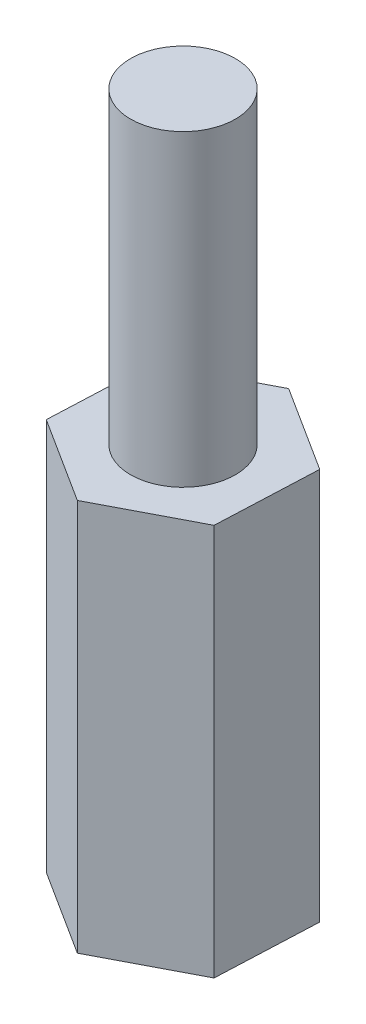
ISO-10303-21;
HEADER;
FILE_DESCRIPTION(('STEP AP214'),'2;1');
FILE_NAME('part.step','',(''),(''),'','','');
FILE_SCHEMA(('AUTOMOTIVE_DESIGN { 1 0 10303 214 1 1 1 1 }'));
ENDSEC;
DATA;
#1=APPLICATION_CONTEXT('core data for automotive mechanical design processes');
#2=APPLICATION_PROTOCOL_DEFINITION('international standard','automotive_design',2000,#1);
#3=PRODUCT_CONTEXT('',#1,'mechanical');
#4=PRODUCT('Part','Part','',(#3));
#5=PRODUCT_RELATED_PRODUCT_CATEGORY('part','',(#4));
#6=PRODUCT_DEFINITION_FORMATION('','',#4);
#7=PRODUCT_DEFINITION_CONTEXT('part definition',#1,'design');
#8=PRODUCT_DEFINITION('design','',#6,#7);
#9=PRODUCT_DEFINITION_SHAPE('','',#8);
#10=(LENGTH_UNIT() NAMED_UNIT(*) SI_UNIT(.MILLI.,.METRE.));
#11=(NAMED_UNIT(*) PLANE_ANGLE_UNIT() SI_UNIT($,.RADIAN.));
#12=(NAMED_UNIT(*) SI_UNIT($,.STERADIAN.) SOLID_ANGLE_UNIT());
#13=UNCERTAINTY_MEASURE_WITH_UNIT(LENGTH_MEASURE(1.E-05),#10,'distance_accuracy_value','');
#14=(GEOMETRIC_REPRESENTATION_CONTEXT(3) GLOBAL_UNCERTAINTY_ASSIGNED_CONTEXT((#13)) GLOBAL_UNIT_ASSIGNED_CONTEXT((#10,
#11,#12)) REPRESENTATION_CONTEXT('',''));
#15=CARTESIAN_POINT('',(0.,0.,0.));
#16=DIRECTION('',(0.,0.,1.));
#17=DIRECTION('',(1.,0.,0.));
#18=AXIS2_PLACEMENT_3D('',#15,#16,#17);
#19=CARTESIAN_POINT('',(3.05366989410376,25.,1.94406794578902));
#20=DIRECTION('',(-0.999061733475591,0.,-0.043308806318649));
#21=DIRECTION('',(-0.043308806318649,0.,0.999061733475592));
#22=AXIS2_PLACEMENT_3D('',#19,#20,#21);
#23=PLANE('',#22);
#24=DIRECTION('',(0.043308806318649,0.,-0.999061733475592));
#25=VECTOR('',#24,1.);
#26=CARTESIAN_POINT('',(3.05366989410376,14.,1.94406794578902));
#27=LINE('',#26,#25);
#28=CARTESIAN_POINT('',(3.05366989410376,14.,1.94406794578902));
#29=VERTEX_POINT('',#28);
#30=CARTESIAN_POINT('',(3.2104471747882,14.,-1.67252173017109));
#31=VERTEX_POINT('',#30);
#32=EDGE_CURVE('E83',#29,#31,#27,.T.);
#33=ORIENTED_EDGE('',*,*,#32,.F.);
#34=DIRECTION('',(0.,-1.,0.));
#35=VECTOR('',#34,1.);
#36=CARTESIAN_POINT('',(3.05366989410376,25.,1.94406794578902));
#37=LINE('',#36,#35);
#38=CARTESIAN_POINT('',(3.05366989410376,0.,1.94406794578902));
#39=VERTEX_POINT('',#38);
#40=EDGE_CURVE('E53',#29,#39,#37,.T.);
#41=ORIENTED_EDGE('',*,*,#40,.T.);
#42=DIRECTION('',(0.043308806318649,0.,-0.999061733475591));
#43=VECTOR('',#42,1.);
#44=CARTESIAN_POINT('',(3.05366989410376,0.,1.94406794578902));
#45=LINE('',#44,#43);
#46=CARTESIAN_POINT('',(3.2104471747882,0.,-1.67252173017109));
#47=VERTEX_POINT('',#46);
#48=EDGE_CURVE('E88',#39,#47,#45,.T.);
#49=ORIENTED_EDGE('',*,*,#48,.T.);
#50=DIRECTION('',(0.,-1.,0.));
#51=VECTOR('',#50,1.);
#52=CARTESIAN_POINT('',(3.2104471747882,25.,-1.67252173017109));
#53=LINE('',#52,#51);
#54=EDGE_CURVE('E39',#31,#47,#53,.T.);
#55=ORIENTED_EDGE('',*,*,#54,.F.);
#56=EDGE_LOOP('',(#33,#41,#49,#55));
#57=FACE_BOUND('',#56,.T.);
#58=ADVANCED_FACE('F32',(#57),#23,.F.);
#59=CARTESIAN_POINT('',(3.2104471747882,25.,-1.67252173017109));
#60=DIRECTION('',(-0.537037393217326,0.,0.843558437979456));
#61=DIRECTION('',(0.843558437979456,0.,0.537037393217326));
#62=AXIS2_PLACEMENT_3D('',#59,#60,#61);
#63=PLANE('',#62);
#64=DIRECTION('',(-0.843558437979456,0.,-0.537037393217326));
#65=VECTOR('',#64,1.);
#66=CARTESIAN_POINT('',(3.2104471747882,14.,-1.67252173017109));
#67=LINE('',#66,#65);
#68=CARTESIAN_POINT('',(0.156777280684437,14.,-3.6165896759601));
#69=VERTEX_POINT('',#68);
#70=EDGE_CURVE('E89',#31,#69,#67,.T.);
#71=ORIENTED_EDGE('',*,*,#70,.F.);
#72=ORIENTED_EDGE('',*,*,#54,.T.);
#73=DIRECTION('',(-0.843558437979456,0.,-0.537037393217326));
#74=VECTOR('',#73,1.);
#75=CARTESIAN_POINT('',(3.2104471747882,0.,-1.67252173017109));
#76=LINE('',#75,#74);
#77=CARTESIAN_POINT('',(0.156777280684437,0.,-3.6165896759601));
#78=VERTEX_POINT('',#77);
#79=EDGE_CURVE('E112',#47,#78,#76,.T.);
#80=ORIENTED_EDGE('',*,*,#79,.T.);
#81=DIRECTION('',(0.,-1.,0.));
#82=VECTOR('',#81,1.);
#83=CARTESIAN_POINT('',(0.156777280684437,25.,-3.6165896759601));
#84=LINE('',#83,#82);
#85=EDGE_CURVE('E106',#69,#78,#84,.T.);
#86=ORIENTED_EDGE('',*,*,#85,.F.);
#87=EDGE_LOOP('',(#71,#72,#80,#86));
#88=FACE_BOUND('',#87,.T.);
#89=ADVANCED_FACE('F110',(#88),#63,.F.);
#90=CARTESIAN_POINT('',(0.156777280684437,25.,-3.6165896759601));
#91=DIRECTION('',(0.462024340258265,0.,0.886867244298105));
#92=DIRECTION('',(0.886867244298105,0.,-0.462024340258265));
#93=AXIS2_PLACEMENT_3D('',#90,#91,#92);
#94=PLANE('',#93);
#95=DIRECTION('',(-0.886867244298105,0.,0.462024340258265));
#96=VECTOR('',#95,1.);
#97=CARTESIAN_POINT('',(0.156777280684437,14.,-3.6165896759601));
#98=LINE('',#97,#96);
#99=CARTESIAN_POINT('',(-3.05366989410376,14.,-1.94406794578902));
#100=VERTEX_POINT('',#99);
#101=EDGE_CURVE('E139',#69,#100,#98,.T.);
#102=ORIENTED_EDGE('',*,*,#101,.F.);
#103=ORIENTED_EDGE('',*,*,#85,.T.);
#104=DIRECTION('',(-0.886867244298105,0.,0.462024340258265));
#105=VECTOR('',#104,1.);
#106=CARTESIAN_POINT('',(0.156777280684437,0.,-3.6165896759601));
#107=LINE('',#106,#105);
#108=CARTESIAN_POINT('',(-3.05366989410376,0.,-1.94406794578902));
#109=VERTEX_POINT('',#108);
#110=EDGE_CURVE('E118',#78,#109,#107,.T.);
#111=ORIENTED_EDGE('',*,*,#110,.T.);
#112=DIRECTION('',(0.,-1.,0.));
#113=VECTOR('',#112,1.);
#114=CARTESIAN_POINT('',(-3.05366989410376,25.,-1.94406794578902));
#115=LINE('',#114,#113);
#116=EDGE_CURVE('E104',#100,#109,#115,.T.);
#117=ORIENTED_EDGE('',*,*,#116,.F.);
#118=EDGE_LOOP('',(#102,#103,#111,#117));
#119=FACE_BOUND('',#118,.T.);
#120=ADVANCED_FACE('F138',(#119),#94,.F.);
#121=CARTESIAN_POINT('',(-3.05366989410376,25.,-1.94406794578902));
#122=DIRECTION('',(0.999061733475591,0.,0.043308806318649));
#123=DIRECTION('',(0.043308806318649,0.,-0.999061733475591));
#124=AXIS2_PLACEMENT_3D('',#121,#122,#123);
#125=PLANE('',#124);
#126=DIRECTION('',(-0.043308806318649,0.,0.999061733475591));
#127=VECTOR('',#126,1.);
#128=CARTESIAN_POINT('',(-3.05366989410376,14.,-1.94406794578902));
#129=LINE('',#128,#127);
#130=CARTESIAN_POINT('',(-3.2104471747882,14.,1.67252173017108));
#131=VERTEX_POINT('',#130);
#132=EDGE_CURVE('E135',#100,#131,#129,.T.);
#133=ORIENTED_EDGE('',*,*,#132,.F.);
#134=ORIENTED_EDGE('',*,*,#116,.T.);
#135=DIRECTION('',(-0.043308806318649,0.,0.999061733475592));
#136=VECTOR('',#135,1.);
#137=CARTESIAN_POINT('',(-3.05366989410376,0.,-1.94406794578902));
#138=LINE('',#137,#136);
#139=CARTESIAN_POINT('',(-3.2104471747882,0.,1.67252173017108));
#140=VERTEX_POINT('',#139);
#141=EDGE_CURVE('E124',#109,#140,#138,.T.);
#142=ORIENTED_EDGE('',*,*,#141,.T.);
#143=DIRECTION('',(0.,-1.,0.));
#144=VECTOR('',#143,1.);
#145=CARTESIAN_POINT('',(-3.2104471747882,25.,1.67252173017108));
#146=LINE('',#145,#144);
#147=EDGE_CURVE('E97',#131,#140,#146,.T.);
#148=ORIENTED_EDGE('',*,*,#147,.F.);
#149=EDGE_LOOP('',(#133,#134,#142,#148));
#150=FACE_BOUND('',#149,.T.);
#151=ADVANCED_FACE('F133',(#150),#125,.F.);
#152=CARTESIAN_POINT('',(-3.2104471747882,25.,1.67252173017108));
#153=DIRECTION('',(0.537037393217326,0.,-0.843558437979456));
#154=DIRECTION('',(-0.843558437979456,0.,-0.537037393217326));
#155=AXIS2_PLACEMENT_3D('',#152,#153,#154);
#156=PLANE('',#155);
#157=DIRECTION('',(0.843558437979456,0.,0.537037393217326));
#158=VECTOR('',#157,1.);
#159=CARTESIAN_POINT('',(-3.2104471747882,14.,1.67252173017108));
#160=LINE('',#159,#158);
#161=CARTESIAN_POINT('',(-0.156777280684436,14.,3.6165896759601));
#162=VERTEX_POINT('',#161);
#163=EDGE_CURVE('E45',#131,#162,#160,.T.);
#164=ORIENTED_EDGE('',*,*,#163,.F.);
#165=ORIENTED_EDGE('',*,*,#147,.T.);
#166=DIRECTION('',(0.843558437979456,0.,0.537037393217326));
#167=VECTOR('',#166,1.);
#168=CARTESIAN_POINT('',(-3.2104471747882,0.,1.67252173017108));
#169=LINE('',#168,#167);
#170=CARTESIAN_POINT('',(-0.156777280684436,0.,3.6165896759601));
#171=VERTEX_POINT('',#170);
#172=EDGE_CURVE('E99',#140,#171,#169,.T.);
#173=ORIENTED_EDGE('',*,*,#172,.T.);
#174=DIRECTION('',(0.,-1.,0.));
#175=VECTOR('',#174,1.);
#176=CARTESIAN_POINT('',(-0.156777280684436,25.,3.6165896759601));
#177=LINE('',#176,#175);
#178=EDGE_CURVE('E95',#162,#171,#177,.T.);
#179=ORIENTED_EDGE('',*,*,#178,.F.);
#180=EDGE_LOOP('',(#164,#165,#173,#179));
#181=FACE_BOUND('',#180,.T.);
#182=ADVANCED_FACE('F129',(#181),#156,.F.);
#183=CARTESIAN_POINT('',(-0.156777280684436,25.,3.6165896759601));
#184=DIRECTION('',(-0.462024340258265,0.,-0.886867244298105));
#185=DIRECTION('',(-0.886867244298105,0.,0.462024340258265));
#186=AXIS2_PLACEMENT_3D('',#183,#184,#185);
#187=PLANE('',#186);
#188=DIRECTION('',(0.886867244298105,0.,-0.462024340258265));
#189=VECTOR('',#188,1.);
#190=CARTESIAN_POINT('',(-0.156777280684436,14.,3.6165896759601));
#191=LINE('',#190,#189);
#192=EDGE_CURVE('E12',#162,#29,#191,.T.);
#193=ORIENTED_EDGE('',*,*,#192,.F.);
#194=ORIENTED_EDGE('',*,*,#178,.T.);
#195=DIRECTION('',(0.886867244298105,0.,-0.462024340258265));
#196=VECTOR('',#195,1.);
#197=CARTESIAN_POINT('',(-0.156777280684436,0.,3.6165896759601));
#198=LINE('',#197,#196);
#199=EDGE_CURVE('E93',#171,#39,#198,.T.);
#200=ORIENTED_EDGE('',*,*,#199,.T.);
#201=ORIENTED_EDGE('',*,*,#40,.F.);
#202=EDGE_LOOP('',(#193,#194,#200,#201));
#203=FACE_BOUND('',#202,.T.);
#204=ADVANCED_FACE('F91',(#203),#187,.F.);
#205=CARTESIAN_POINT('',(3.2104471747882,0.,-1.67252173017109));
#206=DIRECTION('',(0.,1.,0.));
#207=DIRECTION('',(0.,0.,1.));
#208=AXIS2_PLACEMENT_3D('',#205,#206,#207);
#209=PLANE('',#208);
#210=ORIENTED_EDGE('',*,*,#48,.F.);
#211=ORIENTED_EDGE('',*,*,#199,.F.);
#212=ORIENTED_EDGE('',*,*,#172,.F.);
#213=ORIENTED_EDGE('',*,*,#141,.F.);
#214=ORIENTED_EDGE('',*,*,#110,.F.);
#215=ORIENTED_EDGE('',*,*,#79,.F.);
#216=EDGE_LOOP('',(#210,#211,#212,#213,#214,#215));
#217=FACE_BOUND('',#216,.T.);
#218=ADVANCED_FACE('F115',(#217),#209,.F.);
#219=CARTESIAN_POINT('',(0.,14.,0.));
#220=DIRECTION('',(0.,1.,0.));
#221=DIRECTION('',(0.,0.,1.));
#222=AXIS2_PLACEMENT_3D('',#219,#220,#221);
#223=PLANE('',#222);
#224=CARTESIAN_POINT('',(0.,14.,0.));
#225=DIRECTION('',(0.,1.,0.));
#226=DIRECTION('',(0.,0.,1.));
#227=AXIS2_PLACEMENT_3D('',#224,#225,#226);
#228=CIRCLE('',#227,1.87308486100157);
#229=CARTESIAN_POINT('',(0.,14.,1.87308486100157));
#230=VERTEX_POINT('',#229);
#231=EDGE_CURVE('E144',#230,#230,#228,.T.);
#232=ORIENTED_EDGE('',*,*,#231,.F.);
#233=EDGE_LOOP('',(#232));
#234=FACE_BOUND('',#233,.T.);
#235=ORIENTED_EDGE('',*,*,#32,.T.);
#236=ORIENTED_EDGE('',*,*,#70,.T.);
#237=ORIENTED_EDGE('',*,*,#101,.T.);
#238=ORIENTED_EDGE('',*,*,#132,.T.);
#239=ORIENTED_EDGE('',*,*,#163,.T.);
#240=ORIENTED_EDGE('',*,*,#192,.T.);
#241=EDGE_LOOP('',(#235,#236,#237,#238,#239,#240));
#242=FACE_BOUND('',#241,.T.);
#243=ADVANCED_FACE('F82',(#234,#242),#223,.T.);
#244=CARTESIAN_POINT('',(0.,14.,0.));
#245=DIRECTION('',(0.,1.,0.));
#246=DIRECTION('',(0.,0.,1.));
#247=AXIS2_PLACEMENT_3D('',#244,#245,#246);
#248=CYLINDRICAL_SURFACE('',#247,1.87308486100157);
#249=ORIENTED_EDGE('',*,*,#231,.T.);
#250=EDGE_LOOP('',(#249));
#251=FACE_BOUND('',#250,.T.);
#252=CARTESIAN_POINT('',(0.,25.,0.));
#253=DIRECTION('',(0.,1.,0.));
#254=DIRECTION('',(0.,0.,1.));
#255=AXIS2_PLACEMENT_3D('',#252,#253,#254);
#256=CIRCLE('',#255,1.87308486100157);
#257=CARTESIAN_POINT('',(0.,25.,1.87308486100157));
#258=VERTEX_POINT('',#257);
#259=EDGE_CURVE('E145',#258,#258,#256,.T.);
#260=ORIENTED_EDGE('',*,*,#259,.F.);
#261=EDGE_LOOP('',(#260));
#262=FACE_BOUND('',#261,.T.);
#263=ADVANCED_FACE('F151',(#251,#262),#248,.T.);
#264=CARTESIAN_POINT('',(3.2104471747882,25.,-1.67252173017109));
#265=DIRECTION('',(0.,1.,0.));
#266=DIRECTION('',(0.,0.,1.));
#267=AXIS2_PLACEMENT_3D('',#264,#265,#266);
#268=PLANE('',#267);
#269=ORIENTED_EDGE('',*,*,#259,.T.);
#270=EDGE_LOOP('',(#269));
#271=FACE_BOUND('',#270,.T.);
#272=ADVANCED_FACE('F160',(#271),#268,.T.);
#273=CLOSED_SHELL('',(#58,#89,#120,#151,#182,#204,#218,#243,#263,#272));
#274=MANIFOLD_SOLID_BREP('B2',#273);
#275=ADVANCED_BREP_SHAPE_REPRESENTATION('',(#18,#274),#14);
#276=SHAPE_DEFINITION_REPRESENTATION(#9,#275);
ENDSEC;
END-ISO-10303-21;
